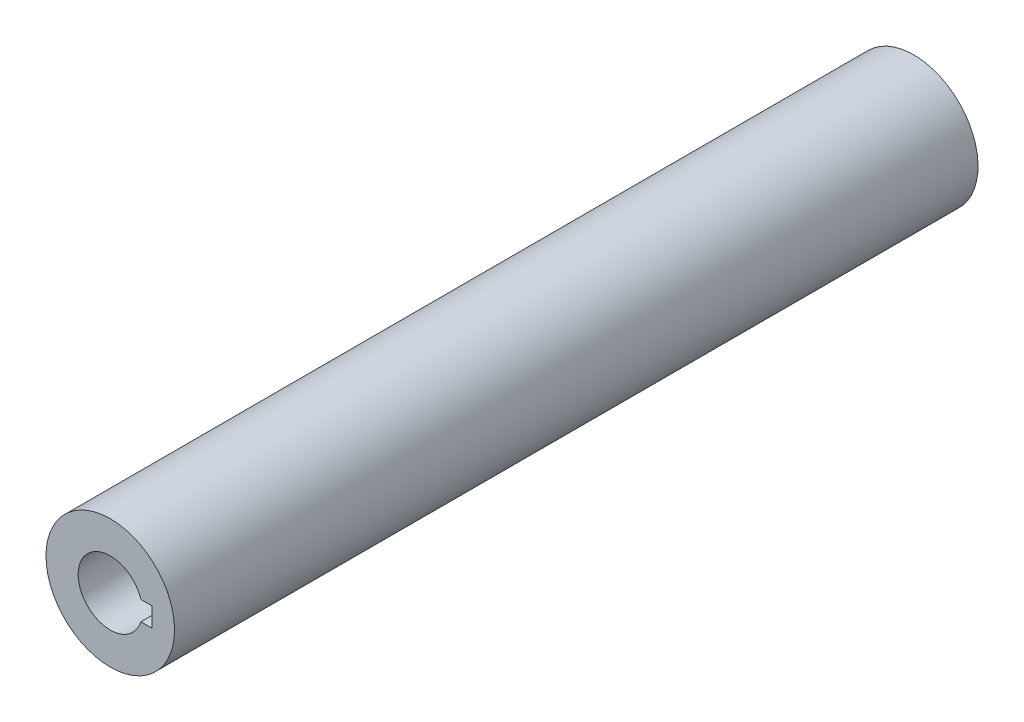
ISO-10303-21;
HEADER;
FILE_DESCRIPTION(('STEP AP214'),'2;1');
FILE_NAME('part.step','',(''),(''),'','','');
FILE_SCHEMA(('AUTOMOTIVE_DESIGN { 1 0 10303 214 1 1 1 1 }'));
ENDSEC;
DATA;
#1=APPLICATION_CONTEXT('core data for automotive mechanical design processes');
#2=APPLICATION_PROTOCOL_DEFINITION('international standard','automotive_design',2000,#1);
#3=PRODUCT_CONTEXT('',#1,'mechanical');
#4=PRODUCT('Part','Part','',(#3));
#5=PRODUCT_RELATED_PRODUCT_CATEGORY('part','',(#4));
#6=PRODUCT_DEFINITION_FORMATION('','',#4);
#7=PRODUCT_DEFINITION_CONTEXT('part definition',#1,'design');
#8=PRODUCT_DEFINITION('design','',#6,#7);
#9=PRODUCT_DEFINITION_SHAPE('','',#8);
#10=(LENGTH_UNIT() NAMED_UNIT(*) SI_UNIT(.MILLI.,.METRE.));
#11=(NAMED_UNIT(*) PLANE_ANGLE_UNIT() SI_UNIT($,.RADIAN.));
#12=(NAMED_UNIT(*) SI_UNIT($,.STERADIAN.) SOLID_ANGLE_UNIT());
#13=UNCERTAINTY_MEASURE_WITH_UNIT(LENGTH_MEASURE(1.E-05),#10,'distance_accuracy_value','');
#14=(GEOMETRIC_REPRESENTATION_CONTEXT(3) GLOBAL_UNCERTAINTY_ASSIGNED_CONTEXT((#13)) GLOBAL_UNIT_ASSIGNED_CONTEXT((#10,
#11,#12)) REPRESENTATION_CONTEXT('',''));
#15=CARTESIAN_POINT('',(0.,0.,0.));
#16=DIRECTION('',(0.,0.,1.));
#17=DIRECTION('',(1.,0.,0.));
#18=AXIS2_PLACEMENT_3D('',#15,#16,#17);
#19=CARTESIAN_POINT('',(0.,0.,-338.291252049755));
#20=DIRECTION('',(0.,0.,1.));
#21=DIRECTION('',(1.,0.,0.));
#22=AXIS2_PLACEMENT_3D('',#19,#20,#21);
#23=CYLINDRICAL_SURFACE('',#22,10.);
#24=CARTESIAN_POINT('',(9.53939201416946,-3.,-48.7227095548314));
#25=CARTESIAN_POINT('',(9.53938054066293,-3.00001028092919,-48.8050479101108));
#26=CARTESIAN_POINT('',(9.54045779392469,-2.9966103938752,-48.8873796807927));
#27=CARTESIAN_POINT('',(9.54470448571776,-2.98307026420713,-49.0514147777185));
#28=CARTESIAN_POINT('',(9.54787345361081,-2.97293153783626,-49.1331182411497));
#29=CARTESIAN_POINT('',(9.55620753798556,-2.94602863460168,-49.2951083344406));
#30=CARTESIAN_POINT('',(9.56136744728884,-2.92928173841085,-49.3753980936667));
#31=CARTESIAN_POINT('',(9.57351674919552,-2.88932692619323,-49.5341908178566));
#32=CARTESIAN_POINT('',(9.5805061895276,-2.86611884160637,-49.6126937361472));
#33=CARTESIAN_POINT('',(9.60391611506093,-2.78708673739489,-49.8446563610476));
#34=CARTESIAN_POINT('',(9.62278944217779,-2.72182078022101,-49.9947729678685));
#35=CARTESIAN_POINT('',(9.66493136751062,-2.5681533150261,-50.281931032014));
#36=CARTESIAN_POINT('',(9.68820215546662,-2.47974027229482,-50.418965923836));
#37=CARTESIAN_POINT('',(9.73733616423826,-2.27930040049353,-50.6804307697605));
#38=CARTESIAN_POINT('',(9.76325431599017,-2.16667315014813,-50.80439100947));
#39=CARTESIAN_POINT('',(9.81429568962703,-1.92227974972484,-51.0319806376168));
#40=CARTESIAN_POINT('',(9.83941875564023,-1.79050987481176,-51.1356060599916));
#41=CARTESIAN_POINT('',(9.88667183343645,-1.50818045237191,-51.3216644336723));
#42=CARTESIAN_POINT('',(9.90872799691547,-1.35728471100045,-51.403607181333));
#43=CARTESIAN_POINT('',(9.94670010628166,-1.04312670278014,-51.5407231956993));
#44=CARTESIAN_POINT('',(9.96262136883706,-0.879875291166889,-51.5959196521859));
#45=CARTESIAN_POINT('',(9.98287420040382,-0.596528917969976,-51.6652474469662));
#46=CARTESIAN_POINT('',(9.98925529459184,-0.478332984300351,-51.6867522715216));
#47=CARTESIAN_POINT('',(9.99783635723861,-0.240114779876294,-51.7154976045989));
#48=CARTESIAN_POINT('',(10.0000377781649,-0.120093158182548,-51.7227430683866));
#49=CARTESIAN_POINT('',(10.,0.,-51.7227095548314));
#50=B_SPLINE_CURVE_WITH_KNOTS('',3,(#24,#25,#26,#27,#28,#29,#30,#31,#32,#33,#34,#35,#36,#37,#38,
#39,#40,#41,#42,#43,#44,#45,#46,#47,#48,#49),.UNSPECIFIED.,.F.,.F.,(4,2,2,2,2,2,2,2,2,2,2,2,4),
(0.,0.246926642096045,0.49379774433698,0.740027500587509,0.986263681104387,1.47812528182602,
1.97023245626458,2.47634460283145,2.98255536261057,3.49938590474303,4.0157675349931,
4.37580149197501,4.73571031156628),.UNSPECIFIED.);
#51=CARTESIAN_POINT('',(9.53939201416946,-3.,-48.7227095548314));
#52=VERTEX_POINT('',#51);
#53=CARTESIAN_POINT('',(10.,0.,-51.7227095548314));
#54=VERTEX_POINT('',#53);
#55=EDGE_CURVE('E160',#52,#54,#50,.T.);
#56=ORIENTED_EDGE('',*,*,#55,.T.);
#57=CARTESIAN_POINT('',(10.,0.,-51.7227095548314));
#58=CARTESIAN_POINT('',(10.0000096080285,0.0824227631463744,-51.7227196373549));
#59=CARTESIAN_POINT('',(9.99898119564177,0.164839419523962,-51.719312976265));
#60=CARTESIAN_POINT('',(9.99491972682128,0.329049154042199,-51.7057444237409));
#61=CARTESIAN_POINT('',(9.99188706824365,0.410842352684431,-51.6955838729962));
#62=CARTESIAN_POINT('',(9.98389820327522,0.573029010046601,-51.6686186573614));
#63=CARTESIAN_POINT('',(9.97894670536667,0.65342539560384,-51.6518302541393));
#64=CARTESIAN_POINT('',(9.96726244195506,0.812432937247887,-51.6117723648655));
#65=CARTESIAN_POINT('',(9.96052964161341,0.891044058385971,-51.5885027520543));
#66=CARTESIAN_POINT('',(9.93791665572714,1.12334751869737,-51.5092476005028));
#67=CARTESIAN_POINT('',(9.91961224749823,1.27369353338764,-51.4437849050414));
#68=CARTESIAN_POINT('',(9.87844788158406,1.56123419028947,-51.2896569777897));
#69=CARTESIAN_POINT('',(9.85558600377791,1.69842325310212,-51.2009819614009));
#70=CARTESIAN_POINT('',(9.8070161559161,1.95973032044495,-51.000268198242));
#71=CARTESIAN_POINT('',(9.78125020543237,2.08342255809079,-50.8876882937272));
#72=CARTESIAN_POINT('',(9.73011891154728,2.31049087548403,-50.6435018256525));
#73=CARTESIAN_POINT('',(9.70475367439976,2.41386164723294,-50.5118903065444));
#74=CARTESIAN_POINT('',(9.65667399274844,2.59963260472334,-50.2297220242391));
#75=CARTESIAN_POINT('',(9.6340331517849,2.68150106243728,-50.0788017957562));
#76=CARTESIAN_POINT('',(9.59485969620407,2.81846982634431,-49.7645998651068));
#77=CARTESIAN_POINT('',(9.57832133561774,2.87359532862629,-49.6013299666191));
#78=CARTESIAN_POINT('',(9.55725691110831,2.94274344350912,-49.3181737230961));
#79=CARTESIAN_POINT('',(9.5506070073494,2.96416883691448,-49.2002021584491));
#80=CARTESIAN_POINT('',(9.54165249238351,2.9928125520524,-48.9624147697659));
#81=CARTESIAN_POINT('',(9.53934691720891,3.00003402552321,-48.8425993608123));
#82=CARTESIAN_POINT('',(9.53939201416946,3.,-48.7227095548314));
#83=B_SPLINE_CURVE_WITH_KNOTS('',3,(#57,#58,#59,#60,#61,#62,#63,#64,#65,#66,#67,#68,#69,#70,#71,
#72,#73,#74,#75,#76,#77,#78,#79,#80,#81,#82),.UNSPECIFIED.,.F.,.F.,(4,2,2,2,2,2,2,2,2,2,2,2,4),
(0.,0.24718104548786,0.494313038630553,0.740842415978008,0.987376615285056,1.47989284612469,
1.97261702064959,2.47798531493201,2.98348543731961,3.50050825438352,4.01704300366042,
4.37641607170517,4.73570938868942),.UNSPECIFIED.);
#84=CARTESIAN_POINT('',(9.53939201416946,3.,-48.7227095548314));
#85=VERTEX_POINT('',#84);
#86=EDGE_CURVE('E167',#54,#85,#83,.T.);
#87=ORIENTED_EDGE('',*,*,#86,.T.);
#88=DIRECTION('',(0.,0.,1.));
#89=VECTOR('',#88,1.);
#90=CARTESIAN_POINT('',(9.53939201416946,3.,-338.291252049755));
#91=LINE('',#90,#89);
#92=CARTESIAN_POINT('',(9.53939201416946,3.,-31.7227095548314));
#93=VERTEX_POINT('',#92);
#94=EDGE_CURVE('E224',#93,#85,#91,.F.);
#95=ORIENTED_EDGE('',*,*,#94,.F.);
#96=CARTESIAN_POINT('',(0.,0.,-31.7227095548315));
#97=DIRECTION('',(0.,0.,-1.));
#98=DIRECTION('',(0.,1.,0.));
#99=AXIS2_PLACEMENT_3D('',#96,#97,#98);
#100=CIRCLE('',#99,10.);
#101=CARTESIAN_POINT('',(9.53939201416946,-3.,-31.7227095548314));
#102=VERTEX_POINT('',#101);
#103=EDGE_CURVE('E237',#102,#93,#100,.T.);
#104=ORIENTED_EDGE('',*,*,#103,.F.);
#105=DIRECTION('',(0.,0.,1.));
#106=VECTOR('',#105,1.);
#107=CARTESIAN_POINT('',(9.53939201416946,-3.,-338.291252049755));
#108=LINE('',#107,#106);
#109=EDGE_CURVE('E283',#52,#102,#108,.T.);
#110=ORIENTED_EDGE('',*,*,#109,.F.);
#111=EDGE_LOOP('',(#56,#87,#95,#104,#110));
#112=FACE_BOUND('',#111,.T.);
#113=DIRECTION('',(0.,0.,1.));
#114=VECTOR('',#113,1.);
#115=CARTESIAN_POINT('',(9.53939201416946,3.,-338.291252049755));
#116=LINE('',#115,#114);
#117=CARTESIAN_POINT('',(9.53939201416946,3.,-264.722709554831));
#118=VERTEX_POINT('',#117);
#119=CARTESIAN_POINT('',(9.53939201416946,3.,-281.722709554832));
#120=VERTEX_POINT('',#119);
#121=EDGE_CURVE('E136',#118,#120,#116,.F.);
#122=ORIENTED_EDGE('',*,*,#121,.F.);
#123=CARTESIAN_POINT('',(9.53939201416946,3.,-264.722709554831));
#124=CARTESIAN_POINT('',(9.53938054066293,3.00001028092919,-264.640371199552));
#125=CARTESIAN_POINT('',(9.54045779392469,2.9966103938752,-264.55803942887));
#126=CARTESIAN_POINT('',(9.54470448571776,2.98307026420713,-264.394004331944));
#127=CARTESIAN_POINT('',(9.54787345361081,2.97293153783626,-264.312300868513));
#128=CARTESIAN_POINT('',(9.55620753798556,2.94602863460168,-264.150310775222));
#129=CARTESIAN_POINT('',(9.56136744728884,2.92928173841085,-264.070021015996));
#130=CARTESIAN_POINT('',(9.57351674919552,2.88932692619323,-263.911228291806));
#131=CARTESIAN_POINT('',(9.5805061895276,2.86611884160637,-263.832725373516));
#132=CARTESIAN_POINT('',(9.60391611506093,2.78708673739489,-263.600762748615));
#133=CARTESIAN_POINT('',(9.62278944217779,2.721820780221,-263.450646141794));
#134=CARTESIAN_POINT('',(9.66493136751062,2.56815331502609,-263.163488077649));
#135=CARTESIAN_POINT('',(9.68820215546662,2.47974027229481,-263.026453185827));
#136=CARTESIAN_POINT('',(9.73733616423826,2.27930040049351,-262.764988339902));
#137=CARTESIAN_POINT('',(9.76325431599017,2.16667315014812,-262.641028100193));
#138=CARTESIAN_POINT('',(9.81429568962703,1.92227974972485,-262.413438472046));
#139=CARTESIAN_POINT('',(9.83941875564022,1.79050987481179,-262.309813049671));
#140=CARTESIAN_POINT('',(9.88667183343644,1.50818045237194,-262.12375467599));
#141=CARTESIAN_POINT('',(9.90872799691547,1.35728471100048,-262.04181192833));
#142=CARTESIAN_POINT('',(9.94670010628166,1.04312670278016,-261.904695913964));
#143=CARTESIAN_POINT('',(9.96262136883706,0.879875291166905,-261.849499457477));
#144=CARTESIAN_POINT('',(9.98287420040382,0.596528917969985,-261.780171662696));
#145=CARTESIAN_POINT('',(9.98925529459184,0.478332984300358,-261.758666838141));
#146=CARTESIAN_POINT('',(9.99783635723861,0.240114779876295,-261.729921505064));
#147=CARTESIAN_POINT('',(10.0000377781649,0.120093158182547,-261.722676041276));
#148=CARTESIAN_POINT('',(10.,0.,-261.722709554831));
#149=B_SPLINE_CURVE_WITH_KNOTS('',3,(#123,#124,#125,#126,#127,#128,#129,#130,#131,#132,#133,
#134,#135,#136,#137,#138,#139,#140,#141,#142,#143,#144,#145,#146,#147,#148),.UNSPECIFIED.,.F.,
.F.,(4,2,2,2,2,2,2,2,2,2,2,2,4),(0.,0.246926642096066,0.493797744336938,0.740027500587501,
0.986263681104372,1.47812528182602,1.97023245626458,2.47634460283144,2.98255536261054,
3.499385904743,4.01576753499308,4.375801491975,4.73571031156629),.UNSPECIFIED.);
#150=CARTESIAN_POINT('',(10.,0.,-261.722709554831));
#151=VERTEX_POINT('',#150);
#152=EDGE_CURVE('E12',#118,#151,#149,.T.);
#153=ORIENTED_EDGE('',*,*,#152,.T.);
#154=CARTESIAN_POINT('',(10.,0.,-261.722709554831));
#155=CARTESIAN_POINT('',(10.0000096080285,-0.0824227631463766,-261.722699472308));
#156=CARTESIAN_POINT('',(9.99898119564177,-0.164839419523966,-261.726106133398));
#157=CARTESIAN_POINT('',(9.99491972682128,-0.329049154042204,-261.739674685922));
#158=CARTESIAN_POINT('',(9.99188706824365,-0.410842352684435,-261.749835236667));
#159=CARTESIAN_POINT('',(9.98389820327522,-0.573029010046605,-261.776800452301));
#160=CARTESIAN_POINT('',(9.97894670536667,-0.653425395603843,-261.793588855523));
#161=CARTESIAN_POINT('',(9.96726244195506,-0.812432937247889,-261.833646744797));
#162=CARTESIAN_POINT('',(9.96052964161341,-0.891044058385973,-261.856916357608));
#163=CARTESIAN_POINT('',(9.93791665572714,-1.12334751869737,-261.93617150916));
#164=CARTESIAN_POINT('',(9.91961224749823,-1.27369353338763,-262.001634204621));
#165=CARTESIAN_POINT('',(9.87844788158406,-1.56123419028946,-262.155762131873));
#166=CARTESIAN_POINT('',(9.85558600377791,-1.69842325310213,-262.244437148262));
#167=CARTESIAN_POINT('',(9.8070161559161,-1.95973032044495,-262.445150911421));
#168=CARTESIAN_POINT('',(9.78125020543238,-2.08342255809077,-262.557730815936));
#169=CARTESIAN_POINT('',(9.73011891154729,-2.310490875484,-262.80191728401));
#170=CARTESIAN_POINT('',(9.70475367439976,-2.41386164723293,-262.933528803118));
#171=CARTESIAN_POINT('',(9.65667399274844,-2.59963260472334,-263.215697085424));
#172=CARTESIAN_POINT('',(9.6340331517849,-2.68150106243728,-263.366617313907));
#173=CARTESIAN_POINT('',(9.59485969620408,-2.8184698263443,-263.680819244556));
#174=CARTESIAN_POINT('',(9.57832133561775,-2.87359532862629,-263.844089143044));
#175=CARTESIAN_POINT('',(9.55725691110831,-2.94274344350913,-264.127245386567));
#176=CARTESIAN_POINT('',(9.5506070073494,-2.96416883691449,-264.245216951214));
#177=CARTESIAN_POINT('',(9.5416524923835,-2.99281255205241,-264.483004339897));
#178=CARTESIAN_POINT('',(9.53934691720891,-3.00003402552322,-264.60281974885));
#179=CARTESIAN_POINT('',(9.53939201416946,-3.,-264.722709554831));
#180=B_SPLINE_CURVE_WITH_KNOTS('',3,(#154,#155,#156,#157,#158,#159,#160,#161,#162,#163,#164,
#165,#166,#167,#168,#169,#170,#171,#172,#173,#174,#175,#176,#177,#178,#179),.UNSPECIFIED.,.F.,
.F.,(4,2,2,2,2,2,2,2,2,2,2,2,4),(0.,0.247181045487861,0.494313038630546,0.74084241597801,
0.987376615285056,1.47989284612468,1.97261702064957,2.47798531493196,2.98348543731958,
3.50050825438347,4.01704300366044,4.37641607170519,4.73570938868941),.UNSPECIFIED.);
#181=CARTESIAN_POINT('',(9.53939201416946,-3.,-264.722709554831));
#182=VERTEX_POINT('',#181);
#183=EDGE_CURVE('E51',#151,#182,#180,.T.);
#184=ORIENTED_EDGE('',*,*,#183,.T.);
#185=DIRECTION('',(0.,0.,1.));
#186=VECTOR('',#185,1.);
#187=CARTESIAN_POINT('',(9.53939201416946,-3.,-338.291252049755));
#188=LINE('',#187,#186);
#189=CARTESIAN_POINT('',(9.53939201416946,-3.,-281.722709554831));
#190=VERTEX_POINT('',#189);
#191=EDGE_CURVE('E123',#190,#182,#188,.T.);
#192=ORIENTED_EDGE('',*,*,#191,.F.);
#193=CARTESIAN_POINT('',(0.,0.,-281.722709554832));
#194=DIRECTION('',(0.,0.,1.));
#195=DIRECTION('',(0.,-1.,0.));
#196=AXIS2_PLACEMENT_3D('',#193,#194,#195);
#197=CIRCLE('',#196,10.);
#198=EDGE_CURVE('E134',#120,#190,#197,.T.);
#199=ORIENTED_EDGE('',*,*,#198,.F.);
#200=EDGE_LOOP('',(#122,#153,#184,#192,#199));
#201=FACE_BOUND('',#200,.T.);
#202=ADVANCED_FACE('F41',(#112,#201),#23,.F.);
#203=CARTESIAN_POINT('',(0.,-9.9999999999995,-281.722709554832));
#204=DIRECTION('',(0.,0.,1.));
#205=DIRECTION('',(-1.,0.,0.));
#206=AXIS2_PLACEMENT_3D('',#203,#204,#205);
#207=PLANE('',#206);
#208=CARTESIAN_POINT('',(0.,0.,-281.722709554832));
#209=DIRECTION('',(0.,0.,1.));
#210=DIRECTION('',(0.,-1.,0.));
#211=AXIS2_PLACEMENT_3D('',#208,#209,#210);
#212=CIRCLE('',#211,20.);
#213=CARTESIAN_POINT('',(0.,-20.,-281.722709554832));
#214=VERTEX_POINT('',#213);
#215=EDGE_CURVE('E149',#214,#214,#212,.T.);
#216=ORIENTED_EDGE('',*,*,#215,.F.);
#217=EDGE_LOOP('',(#216));
#218=FACE_BOUND('',#217,.T.);
#219=DIRECTION('',(1.,0.,0.));
#220=VECTOR('',#219,1.);
#221=CARTESIAN_POINT('',(-20.001,-2.99999999999999,-281.722709554831));
#222=LINE('',#221,#220);
#223=CARTESIAN_POINT('',(13.,-3.,-281.722709554831));
#224=VERTEX_POINT('',#223);
#225=EDGE_CURVE('E119',#190,#224,#222,.T.);
#226=ORIENTED_EDGE('',*,*,#225,.T.);
#227=DIRECTION('',(0.,-1.,0.));
#228=VECTOR('',#227,1.);
#229=CARTESIAN_POINT('',(13.,3.,-281.722709554831));
#230=LINE('',#229,#228);
#231=CARTESIAN_POINT('',(13.,3.,-281.722709554832));
#232=VERTEX_POINT('',#231);
#233=EDGE_CURVE('E131',#232,#224,#230,.T.);
#234=ORIENTED_EDGE('',*,*,#233,.F.);
#235=DIRECTION('',(1.,0.,0.));
#236=VECTOR('',#235,1.);
#237=CARTESIAN_POINT('',(-20.001,3.00000000000001,-281.722709554831));
#238=LINE('',#237,#236);
#239=EDGE_CURVE('E142',#120,#232,#238,.T.);
#240=ORIENTED_EDGE('',*,*,#239,.F.);
#241=ORIENTED_EDGE('',*,*,#198,.T.);
#242=EDGE_LOOP('',(#226,#234,#240,#241));
#243=FACE_BOUND('',#242,.T.);
#244=ADVANCED_FACE('F140',(#218,#243),#207,.F.);
#245=CARTESIAN_POINT('',(0.,0.,-31.7227095548315));
#246=DIRECTION('',(0.,0.,-1.));
#247=DIRECTION('',(0.,1.,0.));
#248=AXIS2_PLACEMENT_3D('',#245,#246,#247);
#249=PLANE('',#248);
#250=CARTESIAN_POINT('',(0.,0.,-31.7227095548315));
#251=DIRECTION('',(0.,0.,-1.));
#252=DIRECTION('',(0.,1.,0.));
#253=AXIS2_PLACEMENT_3D('',#250,#251,#252);
#254=CIRCLE('',#253,20.);
#255=CARTESIAN_POINT('',(0.,20.,-31.7227095548315));
#256=VERTEX_POINT('',#255);
#257=EDGE_CURVE('E144',#256,#256,#254,.T.);
#258=ORIENTED_EDGE('',*,*,#257,.F.);
#259=EDGE_LOOP('',(#258));
#260=FACE_BOUND('',#259,.T.);
#261=DIRECTION('',(1.,0.,0.));
#262=VECTOR('',#261,1.);
#263=CARTESIAN_POINT('',(-20.001,3.00000000000001,-31.7227095548314));
#264=LINE('',#263,#262);
#265=CARTESIAN_POINT('',(13.,3.,-31.7227095548314));
#266=VERTEX_POINT('',#265);
#267=EDGE_CURVE('E227',#93,#266,#264,.T.);
#268=ORIENTED_EDGE('',*,*,#267,.T.);
#269=DIRECTION('',(0.,1.,0.));
#270=VECTOR('',#269,1.);
#271=CARTESIAN_POINT('',(13.,3.,-31.7227095548314));
#272=LINE('',#271,#270);
#273=CARTESIAN_POINT('',(13.,-3.,-31.7227095548314));
#274=VERTEX_POINT('',#273);
#275=EDGE_CURVE('E226',#274,#266,#272,.T.);
#276=ORIENTED_EDGE('',*,*,#275,.F.);
#277=DIRECTION('',(1.,0.,0.));
#278=VECTOR('',#277,1.);
#279=CARTESIAN_POINT('',(-20.001,-2.99999999999999,-31.7227095548314));
#280=LINE('',#279,#278);
#281=EDGE_CURVE('E229',#102,#274,#280,.T.);
#282=ORIENTED_EDGE('',*,*,#281,.F.);
#283=ORIENTED_EDGE('',*,*,#103,.T.);
#284=EDGE_LOOP('',(#268,#276,#282,#283));
#285=FACE_BOUND('',#284,.T.);
#286=ADVANCED_FACE('F248',(#260,#285),#249,.F.);
#287=CARTESIAN_POINT('',(0.,0.,-338.291252049755));
#288=DIRECTION('',(0.,0.,1.));
#289=DIRECTION('',(1.,0.,0.));
#290=AXIS2_PLACEMENT_3D('',#287,#288,#289);
#291=CYLINDRICAL_SURFACE('',#290,20.);
#292=ORIENTED_EDGE('',*,*,#215,.T.);
#293=EDGE_LOOP('',(#292));
#294=FACE_BOUND('',#293,.T.);
#295=ORIENTED_EDGE('',*,*,#257,.T.);
#296=EDGE_LOOP('',(#295));
#297=FACE_BOUND('',#296,.T.);
#298=ADVANCED_FACE('F180',(#294,#297),#291,.T.);
#299=CARTESIAN_POINT('',(-20.001,3.00000000000001,-51.7227095548314));
#300=DIRECTION('',(0.,-1.,0.));
#301=DIRECTION('',(1.,0.,0.));
#302=AXIS2_PLACEMENT_3D('',#299,#300,#301);
#303=PLANE('',#302);
#304=ORIENTED_EDGE('',*,*,#94,.T.);
#305=DIRECTION('',(1.,0.,0.));
#306=VECTOR('',#305,1.);
#307=CARTESIAN_POINT('',(13.,3.,-48.7227095548314));
#308=LINE('',#307,#306);
#309=CARTESIAN_POINT('',(13.,3.,-48.7227095548314));
#310=VERTEX_POINT('',#309);
#311=EDGE_CURVE('E158',#85,#310,#308,.T.);
#312=ORIENTED_EDGE('',*,*,#311,.T.);
#313=DIRECTION('',(0.,0.,-1.));
#314=VECTOR('',#313,1.);
#315=CARTESIAN_POINT('',(13.,3.,-51.7227095548314));
#316=LINE('',#315,#314);
#317=EDGE_CURVE('E221',#266,#310,#316,.T.);
#318=ORIENTED_EDGE('',*,*,#317,.F.);
#319=ORIENTED_EDGE('',*,*,#267,.F.);
#320=EDGE_LOOP('',(#304,#312,#318,#319));
#321=FACE_BOUND('',#320,.T.);
#322=ADVANCED_FACE('F220',(#321),#303,.T.);
#323=CARTESIAN_POINT('',(-20.001,-2.99999999999999,-51.7227095548314));
#324=DIRECTION('',(0.,1.,0.));
#325=DIRECTION('',(-1.,0.,0.));
#326=AXIS2_PLACEMENT_3D('',#323,#324,#325);
#327=PLANE('',#326);
#328=DIRECTION('',(0.,0.,1.));
#329=VECTOR('',#328,1.);
#330=CARTESIAN_POINT('',(13.,-3.,-51.7227095548314));
#331=LINE('',#330,#329);
#332=CARTESIAN_POINT('',(13.,-3.,-48.7227095548314));
#333=VERTEX_POINT('',#332);
#334=EDGE_CURVE('E231',#333,#274,#331,.T.);
#335=ORIENTED_EDGE('',*,*,#334,.F.);
#336=DIRECTION('',(1.,0.,0.));
#337=VECTOR('',#336,1.);
#338=CARTESIAN_POINT('',(9.53939201416945,-3.,-48.7227095548314));
#339=LINE('',#338,#337);
#340=EDGE_CURVE('E155',#333,#52,#339,.F.);
#341=ORIENTED_EDGE('',*,*,#340,.T.);
#342=ORIENTED_EDGE('',*,*,#109,.T.);
#343=ORIENTED_EDGE('',*,*,#281,.T.);
#344=EDGE_LOOP('',(#335,#341,#342,#343));
#345=FACE_BOUND('',#344,.T.);
#346=ADVANCED_FACE('F208',(#345),#327,.T.);
#347=CARTESIAN_POINT('',(13.,0.,0.));
#348=DIRECTION('',(-1.,0.,0.));
#349=DIRECTION('',(0.,-1.,0.));
#350=AXIS2_PLACEMENT_3D('',#347,#348,#349);
#351=PLANE('',#350);
#352=CARTESIAN_POINT('',(13.,0.,-48.7227095548314));
#353=DIRECTION('',(-1.,0.,0.));
#354=DIRECTION('',(0.,-1.,0.));
#355=AXIS2_PLACEMENT_3D('',#352,#353,#354);
#356=CIRCLE('',#355,3.);
#357=CARTESIAN_POINT('',(13.,0.,-51.7227095548314));
#358=VERTEX_POINT('',#357);
#359=EDGE_CURVE('E143',#310,#358,#356,.T.);
#360=ORIENTED_EDGE('',*,*,#359,.T.);
#361=CARTESIAN_POINT('',(13.,0.,-48.7227095548314));
#362=DIRECTION('',(-1.,0.,0.));
#363=DIRECTION('',(0.,-1.,0.));
#364=AXIS2_PLACEMENT_3D('',#361,#362,#363);
#365=CIRCLE('',#364,3.);
#366=EDGE_CURVE('E146',#358,#333,#365,.T.);
#367=ORIENTED_EDGE('',*,*,#366,.T.);
#368=ORIENTED_EDGE('',*,*,#334,.T.);
#369=ORIENTED_EDGE('',*,*,#275,.T.);
#370=ORIENTED_EDGE('',*,*,#317,.T.);
#371=EDGE_LOOP('',(#360,#367,#368,#369,#370));
#372=FACE_BOUND('',#371,.T.);
#373=ADVANCED_FACE('F201',(#372),#351,.T.);
#374=CARTESIAN_POINT('',(-20.001,0.,-48.7227095548314));
#375=DIRECTION('',(-1.,0.,0.));
#376=DIRECTION('',(0.,-1.,0.));
#377=AXIS2_PLACEMENT_3D('',#374,#375,#376);
#378=CYLINDRICAL_SURFACE('',#377,3.);
#379=ORIENTED_EDGE('',*,*,#311,.F.);
#380=ORIENTED_EDGE('',*,*,#86,.F.);
#381=DIRECTION('',(1.,0.,0.));
#382=VECTOR('',#381,1.);
#383=CARTESIAN_POINT('',(9.53939201416946,0.,-51.7227095548314));
#384=LINE('',#383,#382);
#385=EDGE_CURVE('E284',#358,#54,#384,.F.);
#386=ORIENTED_EDGE('',*,*,#385,.F.);
#387=ORIENTED_EDGE('',*,*,#359,.F.);
#388=EDGE_LOOP('',(#379,#380,#386,#387));
#389=FACE_BOUND('',#388,.T.);
#390=ADVANCED_FACE('F198',(#389),#378,.F.);
#391=CARTESIAN_POINT('',(-20.001,0.,-48.7227095548314));
#392=DIRECTION('',(-1.,0.,0.));
#393=DIRECTION('',(0.,-1.,0.));
#394=AXIS2_PLACEMENT_3D('',#391,#392,#393);
#395=CYLINDRICAL_SURFACE('',#394,3.);
#396=ORIENTED_EDGE('',*,*,#55,.F.);
#397=ORIENTED_EDGE('',*,*,#340,.F.);
#398=ORIENTED_EDGE('',*,*,#366,.F.);
#399=ORIENTED_EDGE('',*,*,#385,.T.);
#400=EDGE_LOOP('',(#396,#397,#398,#399));
#401=FACE_BOUND('',#400,.T.);
#402=ADVANCED_FACE('F173',(#401),#395,.F.);
#403=CARTESIAN_POINT('',(-20.001,-2.99999999999999,-281.722709554831));
#404=DIRECTION('',(0.,1.,0.));
#405=DIRECTION('',(-1.,0.,0.));
#406=AXIS2_PLACEMENT_3D('',#403,#404,#405);
#407=PLANE('',#406);
#408=ORIENTED_EDGE('',*,*,#191,.T.);
#409=DIRECTION('',(1.,0.,0.));
#410=VECTOR('',#409,1.);
#411=CARTESIAN_POINT('',(13.,-3.,-264.722709554831));
#412=LINE('',#411,#410);
#413=CARTESIAN_POINT('',(13.,-3.,-264.722709554831));
#414=VERTEX_POINT('',#413);
#415=EDGE_CURVE('E289',#182,#414,#412,.T.);
#416=ORIENTED_EDGE('',*,*,#415,.T.);
#417=DIRECTION('',(0.,0.,1.));
#418=VECTOR('',#417,1.);
#419=CARTESIAN_POINT('',(13.,-3.,-281.722709554831));
#420=LINE('',#419,#418);
#421=EDGE_CURVE('E126',#224,#414,#420,.T.);
#422=ORIENTED_EDGE('',*,*,#421,.F.);
#423=ORIENTED_EDGE('',*,*,#225,.F.);
#424=EDGE_LOOP('',(#408,#416,#422,#423));
#425=FACE_BOUND('',#424,.T.);
#426=ADVANCED_FACE('F121',(#425),#407,.T.);
#427=CARTESIAN_POINT('',(-20.001,3.00000000000001,-281.722709554831));
#428=DIRECTION('',(0.,-1.,0.));
#429=DIRECTION('',(1.,0.,0.));
#430=AXIS2_PLACEMENT_3D('',#427,#428,#429);
#431=PLANE('',#430);
#432=DIRECTION('',(0.,0.,-1.));
#433=VECTOR('',#432,1.);
#434=CARTESIAN_POINT('',(13.,3.,-281.722709554831));
#435=LINE('',#434,#433);
#436=CARTESIAN_POINT('',(13.,3.,-264.722709554831));
#437=VERTEX_POINT('',#436);
#438=EDGE_CURVE('E137',#437,#232,#435,.T.);
#439=ORIENTED_EDGE('',*,*,#438,.F.);
#440=DIRECTION('',(1.,0.,0.));
#441=VECTOR('',#440,1.);
#442=CARTESIAN_POINT('',(9.53939201416946,3.,-264.722709554831));
#443=LINE('',#442,#441);
#444=EDGE_CURVE('E64',#437,#118,#443,.F.);
#445=ORIENTED_EDGE('',*,*,#444,.T.);
#446=ORIENTED_EDGE('',*,*,#121,.T.);
#447=ORIENTED_EDGE('',*,*,#239,.T.);
#448=EDGE_LOOP('',(#439,#445,#446,#447));
#449=FACE_BOUND('',#448,.T.);
#450=ADVANCED_FACE('F265',(#449),#431,.T.);
#451=CARTESIAN_POINT('',(13.,0.,0.));
#452=DIRECTION('',(-1.,0.,0.));
#453=DIRECTION('',(0.,-1.,0.));
#454=AXIS2_PLACEMENT_3D('',#451,#452,#453);
#455=PLANE('',#454);
#456=ORIENTED_EDGE('',*,*,#421,.T.);
#457=CARTESIAN_POINT('',(13.,0.,-264.722709554831));
#458=DIRECTION('',(-1.,0.,0.));
#459=DIRECTION('',(0.,-1.,0.));
#460=AXIS2_PLACEMENT_3D('',#457,#458,#459);
#461=CIRCLE('',#460,3.);
#462=CARTESIAN_POINT('',(13.,0.,-261.722709554831));
#463=VERTEX_POINT('',#462);
#464=EDGE_CURVE('E275',#414,#463,#461,.T.);
#465=ORIENTED_EDGE('',*,*,#464,.T.);
#466=CARTESIAN_POINT('',(13.,0.,-264.722709554831));
#467=DIRECTION('',(-1.,0.,0.));
#468=DIRECTION('',(0.,-1.,0.));
#469=AXIS2_PLACEMENT_3D('',#466,#467,#468);
#470=CIRCLE('',#469,3.);
#471=EDGE_CURVE('E290',#463,#437,#470,.T.);
#472=ORIENTED_EDGE('',*,*,#471,.T.);
#473=ORIENTED_EDGE('',*,*,#438,.T.);
#474=ORIENTED_EDGE('',*,*,#233,.T.);
#475=EDGE_LOOP('',(#456,#465,#472,#473,#474));
#476=FACE_BOUND('',#475,.T.);
#477=ADVANCED_FACE('F268',(#476),#455,.T.);
#478=CARTESIAN_POINT('',(-20.001,0.,-264.722709554831));
#479=DIRECTION('',(-1.,0.,0.));
#480=DIRECTION('',(0.,-1.,0.));
#481=AXIS2_PLACEMENT_3D('',#478,#479,#480);
#482=CYLINDRICAL_SURFACE('',#481,3.);
#483=DIRECTION('',(1.,0.,0.));
#484=VECTOR('',#483,1.);
#485=CARTESIAN_POINT('',(13.,0.,-261.722709554831));
#486=LINE('',#485,#484);
#487=EDGE_CURVE('E46',#151,#463,#486,.T.);
#488=ORIENTED_EDGE('',*,*,#487,.F.);
#489=ORIENTED_EDGE('',*,*,#152,.F.);
#490=ORIENTED_EDGE('',*,*,#444,.F.);
#491=ORIENTED_EDGE('',*,*,#471,.F.);
#492=EDGE_LOOP('',(#488,#489,#490,#491));
#493=FACE_BOUND('',#492,.T.);
#494=ADVANCED_FACE('F43',(#493),#482,.F.);
#495=CARTESIAN_POINT('',(-20.001,0.,-264.722709554831));
#496=DIRECTION('',(-1.,0.,0.));
#497=DIRECTION('',(0.,-1.,0.));
#498=AXIS2_PLACEMENT_3D('',#495,#496,#497);
#499=CYLINDRICAL_SURFACE('',#498,3.);
#500=ORIENTED_EDGE('',*,*,#183,.F.);
#501=ORIENTED_EDGE('',*,*,#487,.T.);
#502=ORIENTED_EDGE('',*,*,#464,.F.);
#503=ORIENTED_EDGE('',*,*,#415,.F.);
#504=EDGE_LOOP('',(#500,#501,#502,#503));
#505=FACE_BOUND('',#504,.T.);
#506=ADVANCED_FACE('F194',(#505),#499,.F.);
#507=CLOSED_SHELL('',(#202,#244,#286,#298,#322,#346,#373,#390,#402,#426,#450,#477,#494,#506));
#508=MANIFOLD_SOLID_BREP('B2',#507);
#509=ADVANCED_BREP_SHAPE_REPRESENTATION('',(#18,#508),#14);
#510=SHAPE_DEFINITION_REPRESENTATION(#9,#509);
ENDSEC;
END-ISO-10303-21;
